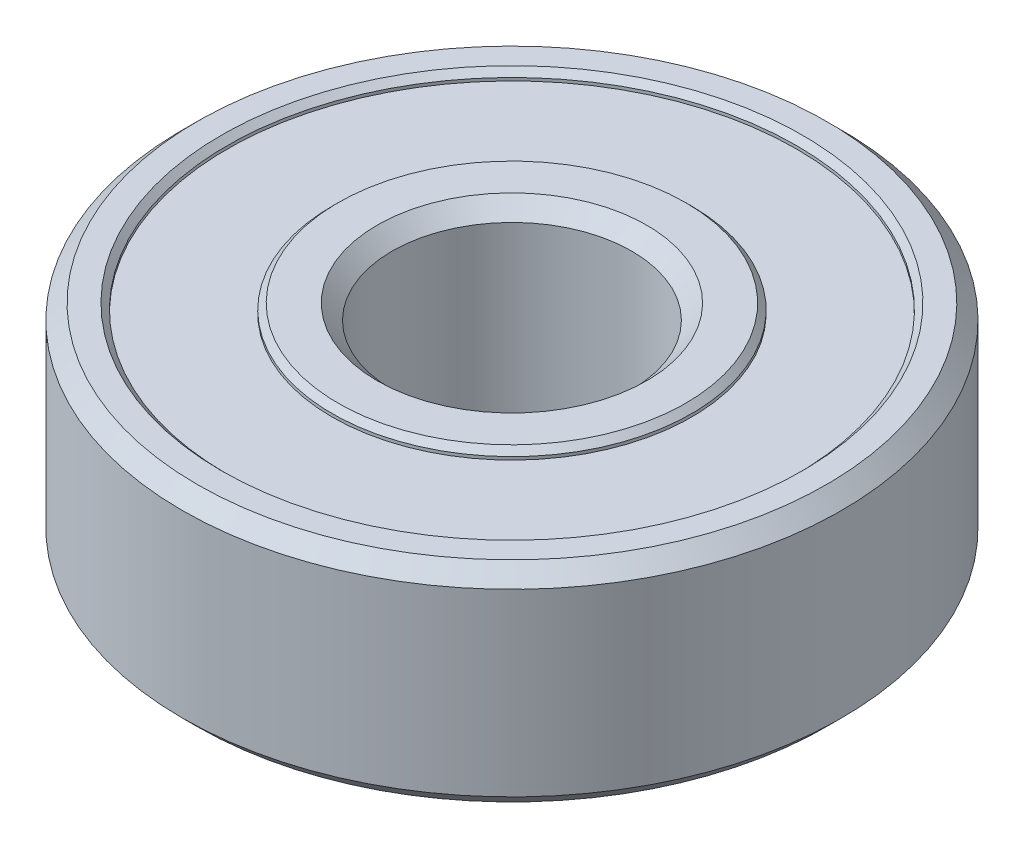
ISO-10303-21;
HEADER;
FILE_DESCRIPTION(('STEP AP214'),'2;1');
FILE_NAME('part.step','',(''),(''),'','','');
FILE_SCHEMA(('AUTOMOTIVE_DESIGN { 1 0 10303 214 1 1 1 1 }'));
ENDSEC;
DATA;
#1=APPLICATION_CONTEXT('core data for automotive mechanical design processes');
#2=APPLICATION_PROTOCOL_DEFINITION('international standard','automotive_design',2000,#1);
#3=PRODUCT_CONTEXT('',#1,'mechanical');
#4=PRODUCT('Part','Part','',(#3));
#5=PRODUCT_RELATED_PRODUCT_CATEGORY('part','',(#4));
#6=PRODUCT_DEFINITION_FORMATION('','',#4);
#7=PRODUCT_DEFINITION_CONTEXT('part definition',#1,'design');
#8=PRODUCT_DEFINITION('design','',#6,#7);
#9=PRODUCT_DEFINITION_SHAPE('','',#8);
#10=(LENGTH_UNIT() NAMED_UNIT(*) SI_UNIT(.MILLI.,.METRE.));
#11=(NAMED_UNIT(*) PLANE_ANGLE_UNIT() SI_UNIT($,.RADIAN.));
#12=(NAMED_UNIT(*) SI_UNIT($,.STERADIAN.) SOLID_ANGLE_UNIT());
#13=UNCERTAINTY_MEASURE_WITH_UNIT(LENGTH_MEASURE(1.E-05),#10,'distance_accuracy_value','');
#14=(GEOMETRIC_REPRESENTATION_CONTEXT(3) GLOBAL_UNCERTAINTY_ASSIGNED_CONTEXT((#13)) GLOBAL_UNIT_ASSIGNED_CONTEXT((#10,
#11,#12)) REPRESENTATION_CONTEXT('',''));
#15=CARTESIAN_POINT('',(0.,0.,0.));
#16=DIRECTION('',(0.,0.,1.));
#17=DIRECTION('',(1.,0.,0.));
#18=AXIS2_PLACEMENT_3D('',#15,#16,#17);
#19=CARTESIAN_POINT('',(0.,7.,0.));
#20=DIRECTION('',(0.,-1.,0.));
#21=DIRECTION('',(0.,0.,-1.));
#22=AXIS2_PLACEMENT_3D('',#19,#20,#21);
#23=CYLINDRICAL_SURFACE('',#22,9.5);
#24=CARTESIAN_POINT('',(0.,6.80000000000001,0.));
#25=DIRECTION('',(0.,1.,0.));
#26=DIRECTION('',(0.,0.,1.));
#27=AXIS2_PLACEMENT_3D('',#24,#25,#26);
#28=CIRCLE('',#27,9.5);
#29=CARTESIAN_POINT('',(0.,6.80000000000001,9.5));
#30=VERTEX_POINT('',#29);
#31=EDGE_CURVE('E86',#30,#30,#28,.T.);
#32=ORIENTED_EDGE('',*,*,#31,.T.);
#33=EDGE_LOOP('',(#32));
#34=FACE_BOUND('',#33,.T.);
#35=CARTESIAN_POINT('',(0.,6.7,0.));
#36=DIRECTION('',(0.,1.,0.));
#37=DIRECTION('',(0.,0.,1.));
#38=AXIS2_PLACEMENT_3D('',#35,#36,#37);
#39=CIRCLE('',#38,9.5);
#40=CARTESIAN_POINT('',(0.,6.7,9.5));
#41=VERTEX_POINT('',#40);
#42=EDGE_CURVE('E101',#41,#41,#39,.T.);
#43=ORIENTED_EDGE('',*,*,#42,.F.);
#44=EDGE_LOOP('',(#43));
#45=FACE_BOUND('',#44,.T.);
#46=ADVANCED_FACE('F44',(#34,#45),#23,.F.);
#47=CARTESIAN_POINT('',(0.,0.200000000000001,0.));
#48=DIRECTION('',(0.,1.,0.));
#49=DIRECTION('',(0.,0.,1.));
#50=AXIS2_PLACEMENT_3D('',#47,#48,#49);
#51=CIRCLE('',#50,9.5);
#52=CARTESIAN_POINT('',(0.,0.200000000000001,9.5));
#53=VERTEX_POINT('',#52);
#54=EDGE_CURVE('E89',#53,#53,#51,.F.);
#55=ORIENTED_EDGE('',*,*,#54,.T.);
#56=EDGE_LOOP('',(#55));
#57=FACE_BOUND('',#56,.T.);
#58=CARTESIAN_POINT('',(0.,0.3,0.));
#59=DIRECTION('',(0.,-1.,0.));
#60=DIRECTION('',(0.,0.,-1.));
#61=AXIS2_PLACEMENT_3D('',#58,#59,#60);
#62=CIRCLE('',#61,9.5);
#63=CARTESIAN_POINT('',(0.,0.3,-9.5));
#64=VERTEX_POINT('',#63);
#65=EDGE_CURVE('E104',#64,#64,#62,.T.);
#66=ORIENTED_EDGE('',*,*,#65,.F.);
#67=EDGE_LOOP('',(#66));
#68=FACE_BOUND('',#67,.T.);
#69=ADVANCED_FACE('F136',(#57,#68),#23,.F.);
#70=CARTESIAN_POINT('',(0.,7.,0.));
#71=DIRECTION('',(0.,-1.,0.));
#72=DIRECTION('',(0.,0.,-1.));
#73=AXIS2_PLACEMENT_3D('',#70,#71,#72);
#74=CYLINDRICAL_SURFACE('',#73,11.);
#75=CARTESIAN_POINT('',(0.,0.499999999999997,0.));
#76=DIRECTION('',(0.,1.,0.));
#77=DIRECTION('',(0.,0.,1.));
#78=AXIS2_PLACEMENT_3D('',#75,#76,#77);
#79=CIRCLE('',#78,11.);
#80=CARTESIAN_POINT('',(0.,0.499999999999997,11.));
#81=VERTEX_POINT('',#80);
#82=EDGE_CURVE('E56',#81,#81,#79,.T.);
#83=ORIENTED_EDGE('',*,*,#82,.T.);
#84=EDGE_LOOP('',(#83));
#85=FACE_BOUND('',#84,.T.);
#86=CARTESIAN_POINT('',(0.,6.50000000000001,0.));
#87=DIRECTION('',(0.,1.,0.));
#88=DIRECTION('',(0.,0.,1.));
#89=AXIS2_PLACEMENT_3D('',#86,#87,#88);
#90=CIRCLE('',#89,11.);
#91=CARTESIAN_POINT('',(0.,6.50000000000001,11.));
#92=VERTEX_POINT('',#91);
#93=EDGE_CURVE('E60',#92,#92,#90,.F.);
#94=ORIENTED_EDGE('',*,*,#93,.T.);
#95=EDGE_LOOP('',(#94));
#96=FACE_BOUND('',#95,.T.);
#97=ADVANCED_FACE('F142',(#85,#96),#74,.T.);
#98=CARTESIAN_POINT('',(0.,7.,0.));
#99=DIRECTION('',(0.,1.,0.));
#100=DIRECTION('',(0.,0.,1.));
#101=AXIS2_PLACEMENT_3D('',#98,#99,#100);
#102=PLANE('',#101);
#103=CARTESIAN_POINT('',(0.,7.,0.));
#104=DIRECTION('',(0.,1.,0.));
#105=DIRECTION('',(0.,0.,1.));
#106=AXIS2_PLACEMENT_3D('',#103,#104,#105);
#107=CIRCLE('',#106,10.5);
#108=CARTESIAN_POINT('',(0.,7.,10.5));
#109=VERTEX_POINT('',#108);
#110=EDGE_CURVE('E11',#109,#109,#107,.T.);
#111=ORIENTED_EDGE('',*,*,#110,.T.);
#112=EDGE_LOOP('',(#111));
#113=FACE_BOUND('',#112,.T.);
#114=CARTESIAN_POINT('',(0.,7.,0.));
#115=DIRECTION('',(0.,1.,0.));
#116=DIRECTION('',(0.,0.,1.));
#117=AXIS2_PLACEMENT_3D('',#114,#115,#116);
#118=CIRCLE('',#117,9.7);
#119=CARTESIAN_POINT('',(0.,7.,9.7));
#120=VERTEX_POINT('',#119);
#121=EDGE_CURVE('E83',#120,#120,#118,.F.);
#122=ORIENTED_EDGE('',*,*,#121,.T.);
#123=EDGE_LOOP('',(#122));
#124=FACE_BOUND('',#123,.T.);
#125=ADVANCED_FACE('F204',(#113,#124),#102,.T.);
#126=CARTESIAN_POINT('',(0.,0.,0.));
#127=DIRECTION('',(0.,1.,0.));
#128=DIRECTION('',(0.,0.,1.));
#129=AXIS2_PLACEMENT_3D('',#126,#127,#128);
#130=PLANE('',#129);
#131=CARTESIAN_POINT('',(0.,0.,0.));
#132=DIRECTION('',(0.,1.,0.));
#133=DIRECTION('',(0.,0.,1.));
#134=AXIS2_PLACEMENT_3D('',#131,#132,#133);
#135=CIRCLE('',#134,10.5);
#136=CARTESIAN_POINT('',(0.,0.,10.5));
#137=VERTEX_POINT('',#136);
#138=EDGE_CURVE('E52',#137,#137,#135,.F.);
#139=ORIENTED_EDGE('',*,*,#138,.T.);
#140=EDGE_LOOP('',(#139));
#141=FACE_BOUND('',#140,.T.);
#142=CARTESIAN_POINT('',(0.,0.,0.));
#143=DIRECTION('',(0.,1.,0.));
#144=DIRECTION('',(0.,0.,1.));
#145=AXIS2_PLACEMENT_3D('',#142,#143,#144);
#146=CIRCLE('',#145,9.7);
#147=CARTESIAN_POINT('',(0.,0.,9.7));
#148=VERTEX_POINT('',#147);
#149=EDGE_CURVE('E92',#148,#148,#146,.T.);
#150=ORIENTED_EDGE('',*,*,#149,.T.);
#151=EDGE_LOOP('',(#150));
#152=FACE_BOUND('',#151,.T.);
#153=ADVANCED_FACE('F210',(#141,#152),#130,.F.);
#154=CARTESIAN_POINT('',(0.,6.7,0.));
#155=DIRECTION('',(0.,1.,0.));
#156=DIRECTION('',(0.,0.,1.));
#157=AXIS2_PLACEMENT_3D('',#154,#155,#156);
#158=PLANE('',#157);
#159=CARTESIAN_POINT('',(0.,6.7,0.));
#160=DIRECTION('',(0.,1.,0.));
#161=DIRECTION('',(0.,0.,1.));
#162=AXIS2_PLACEMENT_3D('',#159,#160,#161);
#163=CIRCLE('',#162,6.);
#164=CARTESIAN_POINT('',(0.,6.7,6.));
#165=VERTEX_POINT('',#164);
#166=EDGE_CURVE('E107',#165,#165,#163,.T.);
#167=ORIENTED_EDGE('',*,*,#166,.F.);
#168=EDGE_LOOP('',(#167));
#169=FACE_BOUND('',#168,.T.);
#170=ORIENTED_EDGE('',*,*,#42,.T.);
#171=EDGE_LOOP('',(#170));
#172=FACE_BOUND('',#171,.T.);
#173=ADVANCED_FACE('F215',(#169,#172),#158,.T.);
#174=CARTESIAN_POINT('',(0.,0.3,0.));
#175=DIRECTION('',(0.,-1.,0.));
#176=DIRECTION('',(0.,0.,-1.));
#177=AXIS2_PLACEMENT_3D('',#174,#175,#176);
#178=PLANE('',#177);
#179=ORIENTED_EDGE('',*,*,#65,.T.);
#180=EDGE_LOOP('',(#179));
#181=FACE_BOUND('',#180,.T.);
#182=CARTESIAN_POINT('',(0.,0.3,0.));
#183=DIRECTION('',(0.,-1.,0.));
#184=DIRECTION('',(0.,0.,-1.));
#185=AXIS2_PLACEMENT_3D('',#182,#183,#184);
#186=CIRCLE('',#185,6.);
#187=CARTESIAN_POINT('',(0.,0.3,-6.));
#188=VERTEX_POINT('',#187);
#189=EDGE_CURVE('E110',#188,#188,#186,.F.);
#190=ORIENTED_EDGE('',*,*,#189,.T.);
#191=EDGE_LOOP('',(#190));
#192=FACE_BOUND('',#191,.T.);
#193=ADVANCED_FACE('F114',(#181,#192),#178,.T.);
#194=CARTESIAN_POINT('',(0.,7.,0.));
#195=DIRECTION('',(0.,-1.,0.));
#196=DIRECTION('',(0.,0.,-1.));
#197=AXIS2_PLACEMENT_3D('',#194,#195,#196);
#198=CYLINDRICAL_SURFACE('',#197,6.);
#199=CARTESIAN_POINT('',(0.,6.80000000000001,0.));
#200=DIRECTION('',(0.,1.,0.));
#201=DIRECTION('',(0.,0.,1.));
#202=AXIS2_PLACEMENT_3D('',#199,#200,#201);
#203=CIRCLE('',#202,6.);
#204=CARTESIAN_POINT('',(0.,6.80000000000001,-6.));
#205=VERTEX_POINT('',#204);
#206=EDGE_CURVE('E77',#205,#205,#203,.F.);
#207=ORIENTED_EDGE('',*,*,#206,.T.);
#208=EDGE_LOOP('',(#207));
#209=FACE_BOUND('',#208,.T.);
#210=ORIENTED_EDGE('',*,*,#166,.T.);
#211=EDGE_LOOP('',(#210));
#212=FACE_BOUND('',#211,.T.);
#213=ADVANCED_FACE('F122',(#209,#212),#198,.T.);
#214=CARTESIAN_POINT('',(0.,7.,0.));
#215=DIRECTION('',(0.,-1.,0.));
#216=DIRECTION('',(0.,0.,-1.));
#217=AXIS2_PLACEMENT_3D('',#214,#215,#216);
#218=CYLINDRICAL_SURFACE('',#217,4.);
#219=CARTESIAN_POINT('',(0.,0.5,0.));
#220=DIRECTION('',(0.,1.,0.));
#221=DIRECTION('',(0.,0.,1.));
#222=AXIS2_PLACEMENT_3D('',#219,#220,#221);
#223=CIRCLE('',#222,4.);
#224=CARTESIAN_POINT('',(0.,0.5,4.));
#225=VERTEX_POINT('',#224);
#226=EDGE_CURVE('E68',#225,#225,#223,.F.);
#227=ORIENTED_EDGE('',*,*,#226,.T.);
#228=EDGE_LOOP('',(#227));
#229=FACE_BOUND('',#228,.T.);
#230=CARTESIAN_POINT('',(0.,6.50000000000001,0.));
#231=DIRECTION('',(0.,1.,0.));
#232=DIRECTION('',(0.,0.,1.));
#233=AXIS2_PLACEMENT_3D('',#230,#231,#232);
#234=CIRCLE('',#233,4.);
#235=CARTESIAN_POINT('',(0.,6.50000000000001,4.));
#236=VERTEX_POINT('',#235);
#237=EDGE_CURVE('E71',#236,#236,#234,.T.);
#238=ORIENTED_EDGE('',*,*,#237,.T.);
#239=EDGE_LOOP('',(#238));
#240=FACE_BOUND('',#239,.T.);
#241=ADVANCED_FACE('F119',(#229,#240),#218,.F.);
#242=CARTESIAN_POINT('',(0.,0.199999999999994,0.));
#243=DIRECTION('',(0.,1.,0.));
#244=DIRECTION('',(0.,0.,1.));
#245=AXIS2_PLACEMENT_3D('',#242,#243,#244);
#246=CIRCLE('',#245,6.);
#247=CARTESIAN_POINT('',(0.,0.199999999999994,6.));
#248=VERTEX_POINT('',#247);
#249=EDGE_CURVE('E98',#248,#248,#246,.T.);
#250=ORIENTED_EDGE('',*,*,#249,.T.);
#251=EDGE_LOOP('',(#250));
#252=FACE_BOUND('',#251,.T.);
#253=ORIENTED_EDGE('',*,*,#189,.F.);
#254=EDGE_LOOP('',(#253));
#255=FACE_BOUND('',#254,.T.);
#256=ADVANCED_FACE('F116',(#252,#255),#198,.T.);
#257=CARTESIAN_POINT('',(0.,7.,0.));
#258=DIRECTION('',(0.,1.,0.));
#259=DIRECTION('',(0.,0.,1.));
#260=AXIS2_PLACEMENT_3D('',#257,#258,#259);
#261=PLANE('',#260);
#262=CARTESIAN_POINT('',(0.,7.,0.));
#263=DIRECTION('',(0.,1.,0.));
#264=DIRECTION('',(0.,0.,1.));
#265=AXIS2_PLACEMENT_3D('',#262,#263,#264);
#266=CIRCLE('',#265,4.5);
#267=CARTESIAN_POINT('',(0.,7.,4.5));
#268=VERTEX_POINT('',#267);
#269=EDGE_CURVE('E65',#268,#268,#266,.F.);
#270=ORIENTED_EDGE('',*,*,#269,.T.);
#271=EDGE_LOOP('',(#270));
#272=FACE_BOUND('',#271,.T.);
#273=CARTESIAN_POINT('',(0.,7.,0.));
#274=DIRECTION('',(0.,1.,0.));
#275=DIRECTION('',(0.,0.,1.));
#276=AXIS2_PLACEMENT_3D('',#273,#274,#275);
#277=CIRCLE('',#276,5.80000000000001);
#278=CARTESIAN_POINT('',(0.,7.,-5.80000000000001));
#279=VERTEX_POINT('',#278);
#280=EDGE_CURVE('E80',#279,#279,#277,.T.);
#281=ORIENTED_EDGE('',*,*,#280,.T.);
#282=EDGE_LOOP('',(#281));
#283=FACE_BOUND('',#282,.T.);
#284=ADVANCED_FACE('F118',(#272,#283),#261,.T.);
#285=CARTESIAN_POINT('',(0.,0.,0.));
#286=DIRECTION('',(0.,1.,0.));
#287=DIRECTION('',(0.,0.,1.));
#288=AXIS2_PLACEMENT_3D('',#285,#286,#287);
#289=PLANE('',#288);
#290=CARTESIAN_POINT('',(0.,0.,0.));
#291=DIRECTION('',(0.,1.,0.));
#292=DIRECTION('',(0.,0.,1.));
#293=AXIS2_PLACEMENT_3D('',#290,#291,#292);
#294=CIRCLE('',#293,4.5);
#295=CARTESIAN_POINT('',(0.,0.,4.5));
#296=VERTEX_POINT('',#295);
#297=EDGE_CURVE('E74',#296,#296,#294,.T.);
#298=ORIENTED_EDGE('',*,*,#297,.T.);
#299=EDGE_LOOP('',(#298));
#300=FACE_BOUND('',#299,.T.);
#301=CARTESIAN_POINT('',(0.,0.,0.));
#302=DIRECTION('',(0.,1.,0.));
#303=DIRECTION('',(0.,0.,1.));
#304=AXIS2_PLACEMENT_3D('',#301,#302,#303);
#305=CIRCLE('',#304,5.8);
#306=CARTESIAN_POINT('',(0.,0.,5.8));
#307=VERTEX_POINT('',#306);
#308=EDGE_CURVE('E95',#307,#307,#305,.F.);
#309=ORIENTED_EDGE('',*,*,#308,.T.);
#310=EDGE_LOOP('',(#309));
#311=FACE_BOUND('',#310,.T.);
#312=ADVANCED_FACE('F127',(#300,#311),#289,.F.);
#313=CARTESIAN_POINT('',(0.,0.199999999999994,0.));
#314=DIRECTION('',(0.,1.,0.));
#315=DIRECTION('',(0.,0.,1.));
#316=AXIS2_PLACEMENT_3D('',#313,#314,#315);
#317=CONICAL_SURFACE('',#316,6.,0.785398163397457);
#318=CARTESIAN_POINT('',(0.,0.,5.8));
#319=CARTESIAN_POINT('',(0.,0.00208333333333303,5.80208333333334));
#320=CARTESIAN_POINT('',(0.,0.00416666666666637,5.80416666666667));
#321=CARTESIAN_POINT('',(0.,0.00833333333333303,5.80833333333334));
#322=CARTESIAN_POINT('',(0.,0.0104166666666664,5.81041666666667));
#323=CARTESIAN_POINT('',(0.,0.0145833333333329,5.81458333333334));
#324=CARTESIAN_POINT('',(0.,0.0166666666666661,5.81666666666667));
#325=CARTESIAN_POINT('',(0.,0.0208333333333326,5.82083333333334));
#326=CARTESIAN_POINT('',(0.,0.0229166666666658,5.82291666666667));
#327=CARTESIAN_POINT('',(0.,0.0270833333333324,5.82708333333334));
#328=CARTESIAN_POINT('',(0.,0.0291666666666658,5.82916666666667));
#329=CARTESIAN_POINT('',(0.,0.0333333333333323,5.83333333333334));
#330=CARTESIAN_POINT('',(0.,0.0354166666666655,5.83541666666667));
#331=CARTESIAN_POINT('',(0.,0.039583333333332,5.83958333333334));
#332=CARTESIAN_POINT('',(0.,0.0416666666666652,5.84166666666667));
#333=CARTESIAN_POINT('',(0.,0.0458333333333318,5.84583333333334));
#334=CARTESIAN_POINT('',(0.,0.0479166666666652,5.84791666666667));
#335=CARTESIAN_POINT('',(0.,0.0520833333333317,5.85208333333334));
#336=CARTESIAN_POINT('',(0.,0.0541666666666649,5.85416666666667));
#337=CARTESIAN_POINT('',(0.,0.0583333333333314,5.85833333333334));
#338=CARTESIAN_POINT('',(0.,0.0604166666666646,5.86041666666667));
#339=CARTESIAN_POINT('',(0.,0.0645833333333312,5.86458333333334));
#340=CARTESIAN_POINT('',(0.,0.0666666666666646,5.86666666666667));
#341=CARTESIAN_POINT('',(0.,0.0708333333333311,5.87083333333334));
#342=CARTESIAN_POINT('',(0.,0.0729166666666643,5.87291666666667));
#343=CARTESIAN_POINT('',(0.,0.0770833333333309,5.87708333333334));
#344=CARTESIAN_POINT('',(0.,0.0791666666666641,5.87916666666667));
#345=CARTESIAN_POINT('',(0.,0.0833333333333306,5.88333333333334));
#346=CARTESIAN_POINT('',(0.,0.0854166666666638,5.88541666666667));
#347=CARTESIAN_POINT('',(0.,0.0895833333333304,5.88958333333334));
#348=CARTESIAN_POINT('',(0.,0.0916666666666638,5.89166666666667));
#349=CARTESIAN_POINT('',(0.,0.0958333333333303,5.89583333333334));
#350=CARTESIAN_POINT('',(0.,0.0979166666666636,5.89791666666667));
#351=CARTESIAN_POINT('',(0.,0.10208333333333,5.90208333333334));
#352=CARTESIAN_POINT('',(0.,0.104166666666663,5.90416666666667));
#353=CARTESIAN_POINT('',(0.,0.10833333333333,5.90833333333334));
#354=CARTESIAN_POINT('',(0.,0.110416666666663,5.91041666666667));
#355=CARTESIAN_POINT('',(0.,0.11458333333333,5.91458333333333));
#356=CARTESIAN_POINT('',(0.,0.116666666666663,5.91666666666667));
#357=CARTESIAN_POINT('',(0.,0.120833333333329,5.92083333333334));
#358=CARTESIAN_POINT('',(0.,0.122916666666663,5.92291666666667));
#359=CARTESIAN_POINT('',(0.,0.127083333333329,5.92708333333334));
#360=CARTESIAN_POINT('',(0.,0.129166666666663,5.92916666666667));
#361=CARTESIAN_POINT('',(0.,0.133333333333329,5.93333333333333));
#362=CARTESIAN_POINT('',(0.,0.135416666666662,5.93541666666667));
#363=CARTESIAN_POINT('',(0.,0.139583333333329,5.93958333333333));
#364=CARTESIAN_POINT('',(0.,0.141666666666662,5.94166666666667));
#365=CARTESIAN_POINT('',(0.,0.145833333333329,5.94583333333334));
#366=CARTESIAN_POINT('',(0.,0.147916666666662,5.94791666666667));
#367=CARTESIAN_POINT('',(0.,0.152083333333328,5.95208333333334));
#368=CARTESIAN_POINT('',(0.,0.154166666666662,5.95416666666667));
#369=CARTESIAN_POINT('',(0.,0.158333333333328,5.95833333333333));
#370=CARTESIAN_POINT('',(0.,0.160416666666662,5.96041666666667));
#371=CARTESIAN_POINT('',(0.,0.164583333333328,5.96458333333333));
#372=CARTESIAN_POINT('',(0.,0.166666666666661,5.96666666666667));
#373=CARTESIAN_POINT('',(0.,0.170833333333328,5.97083333333333));
#374=CARTESIAN_POINT('',(0.,0.172916666666661,5.97291666666667));
#375=CARTESIAN_POINT('',(0.,0.177083333333328,5.97708333333333));
#376=CARTESIAN_POINT('',(0.,0.179166666666661,5.97916666666667));
#377=CARTESIAN_POINT('',(0.,0.183333333333327,5.98333333333333));
#378=CARTESIAN_POINT('',(0.,0.185416666666661,5.98541666666667));
#379=CARTESIAN_POINT('',(0.,0.189583333333327,5.98958333333333));
#380=CARTESIAN_POINT('',(0.,0.191666666666661,5.99166666666667));
#381=CARTESIAN_POINT('',(0.,0.195833333333327,5.99583333333333));
#382=CARTESIAN_POINT('',(0.,0.197916666666661,5.99791666666667));
#383=CARTESIAN_POINT('',(0.,0.199999999999994,6.));
#384=B_SPLINE_CURVE_WITH_KNOTS('',3,(#318,#319,#320,#321,#322,#323,#324,#325,#326,#327,#328,
#329,#330,#331,#332,#333,#334,#335,#336,#337,#338,#339,#340,#341,#342,#343,#344,#345,#346,#347,
#348,#349,#350,#351,#352,#353,#354,#355,#356,#357,#358,#359,#360,#361,#362,#363,#364,#365,#366,
#367,#368,#369,#370,#371,#372,#373,#374,#375,#376,#377,#378,#379,#380,#381,#382,#383),
.UNSPECIFIED.,.F.,.F.,(4,2,2,2,2,2,2,2,2,2,2,2,2,2,2,2,2,2,2,2,2,2,2,2,2,2,2,2,2,2,2,2,4),(0.,
0.00883883476483183,0.017677669529663,0.0265165042944949,0.0353553390593267,0.0441941738241579,
0.0530330085889898,0.0618718433538216,0.0707106781186528,0.0795495128834846,0.0883883476483165,
0.0972271824131477,0.10606601717798,0.114904851942811,0.123743686707643,0.132582521472474,
0.141421356237306,0.150260191002138,0.159099025766969,0.167937860531801,0.176776695296633,
0.185615530061464,0.194454364826296,0.203293199591128,0.21213203435596,0.220970869120791,
0.229809703885623,0.238648538650454,0.247487373415286,0.256326208180118,0.265165042944949,
0.274003877709781,0.282842712474612),.UNSPECIFIED.);
#385=EDGE_CURVE('BSEAM149',#307,#248,#384,.T.);
#386=ORIENTED_EDGE('',*,*,#308,.F.);
#387=ORIENTED_EDGE('',*,*,#249,.F.);
#388=ORIENTED_EDGE('',*,*,#385,.T.);
#389=ORIENTED_EDGE('',*,*,#385,.F.);
#390=EDGE_LOOP('',(#386,#388,#387,#389));
#391=FACE_BOUND('',#390,.T.);
#392=ADVANCED_FACE('F149',(#391),#317,.T.);
#393=CARTESIAN_POINT('',(0.,0.,0.));
#394=DIRECTION('',(0.,-1.,0.));
#395=DIRECTION('',(0.,0.,-1.));
#396=AXIS2_PLACEMENT_3D('',#393,#394,#395);
#397=CONICAL_SURFACE('',#396,9.7,0.785398163397453);
#398=ORIENTED_EDGE('',*,*,#54,.F.);
#399=EDGE_LOOP('',(#398));
#400=FACE_BOUND('',#399,.T.);
#401=ORIENTED_EDGE('',*,*,#149,.F.);
#402=EDGE_LOOP('',(#401));
#403=FACE_BOUND('',#402,.T.);
#404=ADVANCED_FACE('F155',(#400,#403),#397,.F.);
#405=CARTESIAN_POINT('',(0.,6.80000000000001,0.));
#406=DIRECTION('',(0.,1.,0.));
#407=DIRECTION('',(0.,0.,1.));
#408=AXIS2_PLACEMENT_3D('',#405,#406,#407);
#409=CONICAL_SURFACE('',#408,9.5,0.785398163397453);
#410=ORIENTED_EDGE('',*,*,#121,.F.);
#411=EDGE_LOOP('',(#410));
#412=FACE_BOUND('',#411,.T.);
#413=ORIENTED_EDGE('',*,*,#31,.F.);
#414=EDGE_LOOP('',(#413));
#415=FACE_BOUND('',#414,.T.);
#416=ADVANCED_FACE('F162',(#412,#415),#409,.F.);
#417=CARTESIAN_POINT('',(0.,7.,0.));
#418=DIRECTION('',(0.,-1.,0.));
#419=DIRECTION('',(0.,0.,-1.));
#420=AXIS2_PLACEMENT_3D('',#417,#418,#419);
#421=CONICAL_SURFACE('',#420,5.80000000000001,0.785398163397453);
#422=CARTESIAN_POINT('',(0.,6.80000000000001,-6.));
#423=CARTESIAN_POINT('',(0.,6.80208333333334,-5.99791666666667));
#424=CARTESIAN_POINT('',(0.,6.80416666666667,-5.99583333333333));
#425=CARTESIAN_POINT('',(0.,6.80833333333334,-5.99166666666667));
#426=CARTESIAN_POINT('',(0.,6.81041666666667,-5.98958333333333));
#427=CARTESIAN_POINT('',(0.,6.81458333333334,-5.98541666666667));
#428=CARTESIAN_POINT('',(0.,6.81666666666667,-5.98333333333334));
#429=CARTESIAN_POINT('',(0.,6.82083333333334,-5.97916666666667));
#430=CARTESIAN_POINT('',(0.,6.82291666666667,-5.97708333333334));
#431=CARTESIAN_POINT('',(0.,6.82708333333334,-5.97291666666667));
#432=CARTESIAN_POINT('',(0.,6.82916666666667,-5.97083333333333));
#433=CARTESIAN_POINT('',(0.,6.83333333333334,-5.96666666666667));
#434=CARTESIAN_POINT('',(0.,6.83541666666667,-5.96458333333334));
#435=CARTESIAN_POINT('',(0.,6.83958333333334,-5.96041666666667));
#436=CARTESIAN_POINT('',(0.,6.84166666666667,-5.95833333333334));
#437=CARTESIAN_POINT('',(0.,6.84583333333334,-5.95416666666667));
#438=CARTESIAN_POINT('',(0.,6.84791666666667,-5.95208333333334));
#439=CARTESIAN_POINT('',(0.,6.85208333333334,-5.94791666666667));
#440=CARTESIAN_POINT('',(0.,6.85416666666667,-5.94583333333334));
#441=CARTESIAN_POINT('',(0.,6.85833333333334,-5.94166666666667));
#442=CARTESIAN_POINT('',(0.,6.86041666666667,-5.93958333333334));
#443=CARTESIAN_POINT('',(0.,6.86458333333334,-5.93541666666667));
#444=CARTESIAN_POINT('',(0.,6.86666666666667,-5.93333333333334));
#445=CARTESIAN_POINT('',(0.,6.87083333333334,-5.92916666666667));
#446=CARTESIAN_POINT('',(0.,6.87291666666667,-5.92708333333334));
#447=CARTESIAN_POINT('',(0.,6.87708333333334,-5.92291666666667));
#448=CARTESIAN_POINT('',(0.,6.87916666666667,-5.92083333333334));
#449=CARTESIAN_POINT('',(0.,6.88333333333334,-5.91666666666667));
#450=CARTESIAN_POINT('',(0.,6.88541666666667,-5.91458333333334));
#451=CARTESIAN_POINT('',(0.,6.88958333333334,-5.91041666666667));
#452=CARTESIAN_POINT('',(0.,6.89166666666667,-5.90833333333334));
#453=CARTESIAN_POINT('',(0.,6.89583333333334,-5.90416666666667));
#454=CARTESIAN_POINT('',(0.,6.89791666666667,-5.90208333333334));
#455=CARTESIAN_POINT('',(0.,6.90208333333334,-5.89791666666667));
#456=CARTESIAN_POINT('',(0.,6.90416666666667,-5.89583333333334));
#457=CARTESIAN_POINT('',(0.,6.90833333333334,-5.89166666666667));
#458=CARTESIAN_POINT('',(0.,6.91041666666667,-5.88958333333334));
#459=CARTESIAN_POINT('',(0.,6.91458333333334,-5.88541666666667));
#460=CARTESIAN_POINT('',(0.,6.91666666666667,-5.88333333333334));
#461=CARTESIAN_POINT('',(0.,6.92083333333334,-5.87916666666667));
#462=CARTESIAN_POINT('',(0.,6.92291666666667,-5.87708333333334));
#463=CARTESIAN_POINT('',(0.,6.92708333333334,-5.87291666666667));
#464=CARTESIAN_POINT('',(0.,6.92916666666667,-5.87083333333334));
#465=CARTESIAN_POINT('',(0.,6.93333333333333,-5.86666666666667));
#466=CARTESIAN_POINT('',(0.,6.93541666666667,-5.86458333333334));
#467=CARTESIAN_POINT('',(0.,6.93958333333333,-5.86041666666667));
#468=CARTESIAN_POINT('',(0.,6.94166666666667,-5.85833333333334));
#469=CARTESIAN_POINT('',(0.,6.94583333333333,-5.85416666666667));
#470=CARTESIAN_POINT('',(0.,6.94791666666667,-5.85208333333334));
#471=CARTESIAN_POINT('',(0.,6.95208333333333,-5.84791666666667));
#472=CARTESIAN_POINT('',(0.,6.95416666666667,-5.84583333333334));
#473=CARTESIAN_POINT('',(0.,6.95833333333333,-5.84166666666667));
#474=CARTESIAN_POINT('',(0.,6.96041666666667,-5.83958333333334));
#475=CARTESIAN_POINT('',(0.,6.96458333333333,-5.83541666666667));
#476=CARTESIAN_POINT('',(0.,6.96666666666667,-5.83333333333334));
#477=CARTESIAN_POINT('',(0.,6.97083333333333,-5.82916666666667));
#478=CARTESIAN_POINT('',(0.,6.97291666666667,-5.82708333333334));
#479=CARTESIAN_POINT('',(0.,6.97708333333333,-5.82291666666667));
#480=CARTESIAN_POINT('',(0.,6.97916666666667,-5.82083333333334));
#481=CARTESIAN_POINT('',(0.,6.98333333333333,-5.81666666666667));
#482=CARTESIAN_POINT('',(0.,6.98541666666667,-5.81458333333334));
#483=CARTESIAN_POINT('',(0.,6.98958333333333,-5.81041666666667));
#484=CARTESIAN_POINT('',(0.,6.99166666666667,-5.80833333333334));
#485=CARTESIAN_POINT('',(0.,6.99583333333333,-5.80416666666667));
#486=CARTESIAN_POINT('',(0.,6.99791666666667,-5.80208333333334));
#487=CARTESIAN_POINT('',(0.,7.,-5.80000000000001));
#488=B_SPLINE_CURVE_WITH_KNOTS('',3,(#422,#423,#424,#425,#426,#427,#428,#429,#430,#431,#432,
#433,#434,#435,#436,#437,#438,#439,#440,#441,#442,#443,#444,#445,#446,#447,#448,#449,#450,#451,
#452,#453,#454,#455,#456,#457,#458,#459,#460,#461,#462,#463,#464,#465,#466,#467,#468,#469,#470,
#471,#472,#473,#474,#475,#476,#477,#478,#479,#480,#481,#482,#483,#484,#485,#486,#487),
.UNSPECIFIED.,.F.,.F.,(4,2,2,2,2,2,2,2,2,2,2,2,2,2,2,2,2,2,2,2,2,2,2,2,2,2,2,2,2,2,2,2,4),(0.,
0.00883883476483148,0.0176776695296636,0.0265165042944944,0.0353553390593265,0.044194173824158,
0.0530330085889895,0.061871843353821,0.0707106781186531,0.0795495128834846,0.088388347648316,
0.0972271824131475,0.106066017177979,0.114904851942811,0.123743686707642,0.132582521472474,
0.141421356237306,0.150260191002137,0.159099025766969,0.1679378605318,0.176776695296632,
0.185615530061464,0.194454364826295,0.203293199591127,0.212132034355959,0.22097086912079,
0.229809703885622,0.238648538650453,0.247487373415285,0.256326208180117,0.265165042944947,
0.27400387770978,0.282842712474611),.UNSPECIFIED.);
#489=EDGE_CURVE('BSEAM169',#205,#279,#488,.T.);
#490=ORIENTED_EDGE('',*,*,#206,.F.);
#491=ORIENTED_EDGE('',*,*,#280,.F.);
#492=ORIENTED_EDGE('',*,*,#489,.T.);
#493=ORIENTED_EDGE('',*,*,#489,.F.);
#494=EDGE_LOOP('',(#490,#492,#491,#493));
#495=FACE_BOUND('',#494,.T.);
#496=ADVANCED_FACE('F169',(#495),#421,.T.);
#497=CARTESIAN_POINT('',(0.,0.,0.));
#498=DIRECTION('',(0.,-1.,0.));
#499=DIRECTION('',(0.,0.,-1.));
#500=AXIS2_PLACEMENT_3D('',#497,#498,#499);
#501=CONICAL_SURFACE('',#500,4.5,0.785398163397445);
#502=ORIENTED_EDGE('',*,*,#226,.F.);
#503=EDGE_LOOP('',(#502));
#504=FACE_BOUND('',#503,.T.);
#505=ORIENTED_EDGE('',*,*,#297,.F.);
#506=EDGE_LOOP('',(#505));
#507=FACE_BOUND('',#506,.T.);
#508=ADVANCED_FACE('F176',(#504,#507),#501,.F.);
#509=CARTESIAN_POINT('',(0.,6.50000000000001,0.));
#510=DIRECTION('',(0.,1.,0.));
#511=DIRECTION('',(0.,0.,1.));
#512=AXIS2_PLACEMENT_3D('',#509,#510,#511);
#513=CONICAL_SURFACE('',#512,4.,0.785398163397452);
#514=ORIENTED_EDGE('',*,*,#269,.F.);
#515=EDGE_LOOP('',(#514));
#516=FACE_BOUND('',#515,.T.);
#517=ORIENTED_EDGE('',*,*,#237,.F.);
#518=EDGE_LOOP('',(#517));
#519=FACE_BOUND('',#518,.T.);
#520=ADVANCED_FACE('F183',(#516,#519),#513,.F.);
#521=CARTESIAN_POINT('',(0.,0.499999999999997,0.));
#522=DIRECTION('',(0.,1.,0.));
#523=DIRECTION('',(0.,0.,1.));
#524=AXIS2_PLACEMENT_3D('',#521,#522,#523);
#525=CONICAL_SURFACE('',#524,11.,0.785398163397452);
#526=ORIENTED_EDGE('',*,*,#138,.F.);
#527=EDGE_LOOP('',(#526));
#528=FACE_BOUND('',#527,.T.);
#529=ORIENTED_EDGE('',*,*,#82,.F.);
#530=EDGE_LOOP('',(#529));
#531=FACE_BOUND('',#530,.T.);
#532=ADVANCED_FACE('F189',(#528,#531),#525,.T.);
#533=CARTESIAN_POINT('',(0.,7.,0.));
#534=DIRECTION('',(0.,-1.,0.));
#535=DIRECTION('',(0.,0.,-1.));
#536=AXIS2_PLACEMENT_3D('',#533,#534,#535);
#537=CONICAL_SURFACE('',#536,10.5,0.785398163397448);
#538=ORIENTED_EDGE('',*,*,#93,.F.);
#539=EDGE_LOOP('',(#538));
#540=FACE_BOUND('',#539,.T.);
#541=ORIENTED_EDGE('',*,*,#110,.F.);
#542=EDGE_LOOP('',(#541));
#543=FACE_BOUND('',#542,.T.);
#544=ADVANCED_FACE('F47',(#540,#543),#537,.T.);
#545=CLOSED_SHELL('',(#46,#69,#97,#125,#153,#173,#193,#213,#241,#256,#284,#312,#392,#404,#416,
#496,#508,#520,#532,#544));
#546=MANIFOLD_SOLID_BREP('B2',#545);
#547=ADVANCED_BREP_SHAPE_REPRESENTATION('',(#18,#546),#14);
#548=SHAPE_DEFINITION_REPRESENTATION(#9,#547);
ENDSEC;
END-ISO-10303-21;
